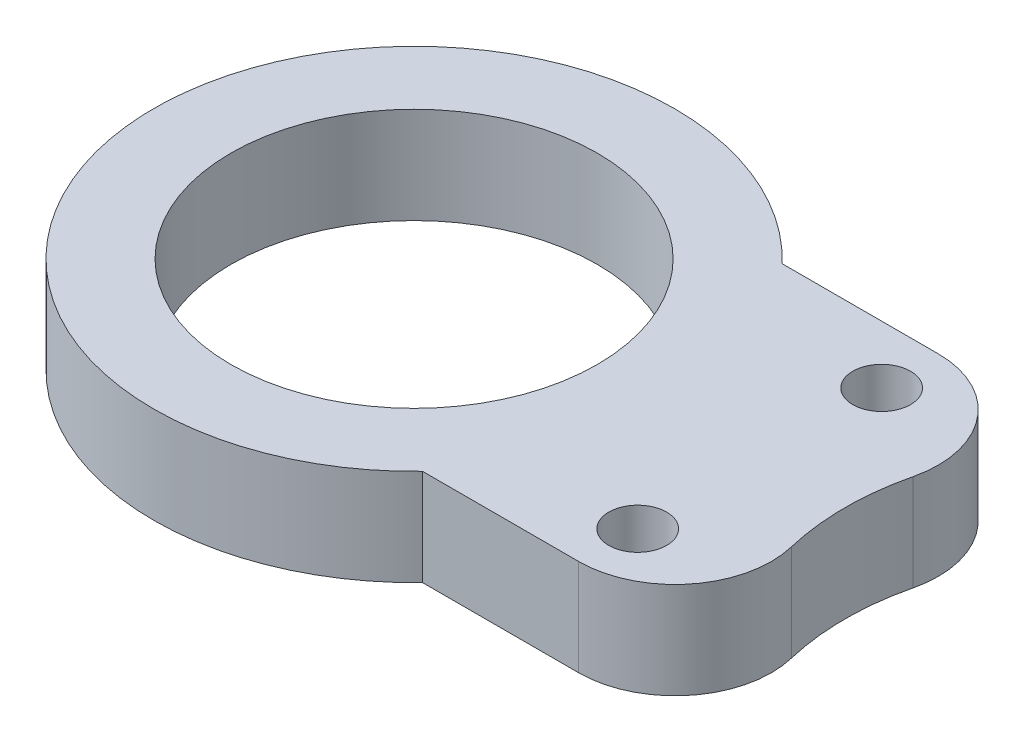
ISO-10303-21;
HEADER;
FILE_DESCRIPTION(('STEP AP214'),'2;1');
FILE_NAME('part.step','',(''),(''),'','','');
FILE_SCHEMA(('AUTOMOTIVE_DESIGN { 1 0 10303 214 1 1 1 1 }'));
ENDSEC;
DATA;
#1=APPLICATION_CONTEXT('core data for automotive mechanical design processes');
#2=APPLICATION_PROTOCOL_DEFINITION('international standard','automotive_design',2000,#1);
#3=PRODUCT_CONTEXT('',#1,'mechanical');
#4=PRODUCT('Part','Part','',(#3));
#5=PRODUCT_RELATED_PRODUCT_CATEGORY('part','',(#4));
#6=PRODUCT_DEFINITION_FORMATION('','',#4);
#7=PRODUCT_DEFINITION_CONTEXT('part definition',#1,'design');
#8=PRODUCT_DEFINITION('design','',#6,#7);
#9=PRODUCT_DEFINITION_SHAPE('','',#8);
#10=(LENGTH_UNIT() NAMED_UNIT(*) SI_UNIT(.MILLI.,.METRE.));
#11=(NAMED_UNIT(*) PLANE_ANGLE_UNIT() SI_UNIT($,.RADIAN.));
#12=(NAMED_UNIT(*) SI_UNIT($,.STERADIAN.) SOLID_ANGLE_UNIT());
#13=UNCERTAINTY_MEASURE_WITH_UNIT(LENGTH_MEASURE(1.E-05),#10,'distance_accuracy_value','');
#14=(GEOMETRIC_REPRESENTATION_CONTEXT(3) GLOBAL_UNCERTAINTY_ASSIGNED_CONTEXT((#13)) GLOBAL_UNIT_ASSIGNED_CONTEXT((#10,
#11,#12)) REPRESENTATION_CONTEXT('',''));
#15=CARTESIAN_POINT('',(0.,0.,0.));
#16=DIRECTION('',(0.,0.,1.));
#17=DIRECTION('',(1.,0.,0.));
#18=AXIS2_PLACEMENT_3D('',#15,#16,#17);
#19=CARTESIAN_POINT('',(-17.9245283018868,-2.35849056603774,0.));
#20=DIRECTION('',(0.,1.,0.));
#21=DIRECTION('',(0.,0.,-1.));
#22=AXIS2_PLACEMENT_3D('',#19,#20,#21);
#23=PLANE('',#22);
#24=CARTESIAN_POINT('',(0.,-2.35849056603774,6.32547169811321));
#25=DIRECTION('',(0.,-1.,0.));
#26=DIRECTION('',(0.,0.,-1.));
#27=AXIS2_PLACEMENT_3D('',#24,#25,#26);
#28=CIRCLE('',#27,1.5);
#29=CARTESIAN_POINT('',(0.,-2.35849056603774,4.82547169811321));
#30=VERTEX_POINT('',#29);
#31=EDGE_CURVE('E145',#30,#30,#28,.T.);
#32=ORIENTED_EDGE('',*,*,#31,.F.);
#33=EDGE_LOOP('',(#32));
#34=FACE_BOUND('',#33,.T.);
#35=CARTESIAN_POINT('',(0.,-2.35849056603774,-6.3254716981132));
#36=DIRECTION('',(0.,-1.,0.));
#37=DIRECTION('',(0.,0.,-1.));
#38=AXIS2_PLACEMENT_3D('',#35,#36,#37);
#39=CIRCLE('',#38,1.5);
#40=CARTESIAN_POINT('',(0.,-2.35849056603774,-7.8254716981132));
#41=VERTEX_POINT('',#40);
#42=EDGE_CURVE('E146',#41,#41,#39,.T.);
#43=ORIENTED_EDGE('',*,*,#42,.F.);
#44=EDGE_LOOP('',(#43));
#45=FACE_BOUND('',#44,.T.);
#46=CARTESIAN_POINT('',(-17.9245283018868,-2.35849056603774,0.));
#47=DIRECTION('',(0.,-1.,0.));
#48=DIRECTION('',(0.,0.,-1.));
#49=AXIS2_PLACEMENT_3D('',#46,#47,#48);
#50=CIRCLE('',#49,9.5);
#51=CARTESIAN_POINT('',(-17.9245283018868,-2.35849056603774,-9.5));
#52=VERTEX_POINT('',#51);
#53=EDGE_CURVE('E138',#52,#52,#50,.T.);
#54=ORIENTED_EDGE('',*,*,#53,.F.);
#55=EDGE_LOOP('',(#54));
#56=FACE_BOUND('',#55,.T.);
#57=CARTESIAN_POINT('',(17.9245283018868,-2.35849056603774,0.));
#58=DIRECTION('',(0.,-1.,0.));
#59=DIRECTION('',(0.,0.,-1.));
#60=AXIS2_PLACEMENT_3D('',#57,#58,#59);
#61=CIRCLE('',#60,13.5);
#62=CARTESIAN_POINT('',(4.79871482734986,-2.35849056603774,3.15642529321774));
#63=VERTEX_POINT('',#62);
#64=CARTESIAN_POINT('',(4.79871482734986,-2.35849056603774,-3.15642529321774));
#65=VERTEX_POINT('',#64);
#66=EDGE_CURVE('E143',#63,#65,#61,.T.);
#67=ORIENTED_EDGE('',*,*,#66,.F.);
#68=CARTESIAN_POINT('',(-0.0626975706267828,-2.35849056603774,4.32547169811322));
#69=DIRECTION('',(0.,-1.,0.));
#70=DIRECTION('',(0.,0.,-1.));
#71=AXIS2_PLACEMENT_3D('',#68,#69,#70);
#72=CIRCLE('',#71,5.);
#73=CARTESIAN_POINT('',(-0.0626975706267898,-2.35849056603774,9.32547169811321));
#74=VERTEX_POINT('',#73);
#75=EDGE_CURVE('E130',#74,#63,#72,.F.);
#76=ORIENTED_EDGE('',*,*,#75,.F.);
#77=DIRECTION('',(-1.,0.,0.));
#78=VECTOR('',#77,1.);
#79=CARTESIAN_POINT('',(8.16309512802911,-2.35849056603774,9.32547169811322));
#80=LINE('',#79,#78);
#81=CARTESIAN_POINT('',(-8.16309512802911,-2.35849056603774,9.32547169811322));
#82=VERTEX_POINT('',#81);
#83=EDGE_CURVE('E137',#74,#82,#80,.T.);
#84=ORIENTED_EDGE('',*,*,#83,.T.);
#85=CARTESIAN_POINT('',(-17.9245283018868,-2.35849056603774,0.));
#86=DIRECTION('',(0.,-1.,0.));
#87=DIRECTION('',(0.,0.,-1.));
#88=AXIS2_PLACEMENT_3D('',#85,#86,#87);
#89=CIRCLE('',#88,13.5);
#90=CARTESIAN_POINT('',(-8.1630951280291,-2.35849056603774,-9.3254716981132));
#91=VERTEX_POINT('',#90);
#92=EDGE_CURVE('E136',#82,#91,#89,.T.);
#93=ORIENTED_EDGE('',*,*,#92,.T.);
#94=DIRECTION('',(1.,0.,0.));
#95=VECTOR('',#94,1.);
#96=CARTESIAN_POINT('',(-8.1630951280291,-2.35849056603774,-9.3254716981132));
#97=LINE('',#96,#95);
#98=CARTESIAN_POINT('',(-0.0626975706267915,-2.35849056603774,-9.3254716981132));
#99=VERTEX_POINT('',#98);
#100=EDGE_CURVE('E117',#91,#99,#97,.T.);
#101=ORIENTED_EDGE('',*,*,#100,.T.);
#102=CARTESIAN_POINT('',(-0.0626975706267898,-2.35849056603774,-4.3254716981132));
#103=DIRECTION('',(0.,-1.,0.));
#104=DIRECTION('',(0.,0.,-1.));
#105=AXIS2_PLACEMENT_3D('',#102,#103,#104);
#106=CIRCLE('',#105,5.);
#107=EDGE_CURVE('E49',#65,#99,#106,.F.);
#108=ORIENTED_EDGE('',*,*,#107,.F.);
#109=EDGE_LOOP('',(#67,#76,#84,#93,#101,#108));
#110=FACE_BOUND('',#109,.T.);
#111=ADVANCED_FACE('F41',(#34,#45,#56,#110),#23,.F.);
#112=CARTESIAN_POINT('',(-8.1630951280291,-2.35849056603774,-9.3254716981132));
#113=DIRECTION('',(0.,0.,-1.));
#114=DIRECTION('',(1.,0.,0.));
#115=AXIS2_PLACEMENT_3D('',#112,#113,#114);
#116=PLANE('',#115);
#117=ORIENTED_EDGE('',*,*,#100,.F.);
#118=DIRECTION('',(0.,1.,0.));
#119=VECTOR('',#118,1.);
#120=CARTESIAN_POINT('',(-8.1630951280291,-2.35849056603774,-9.3254716981132));
#121=LINE('',#120,#119);
#122=CARTESIAN_POINT('',(-8.16309512802909,2.64150943396226,-9.32547169811321));
#123=VERTEX_POINT('',#122);
#124=EDGE_CURVE('E99',#91,#123,#121,.T.);
#125=ORIENTED_EDGE('',*,*,#124,.T.);
#126=DIRECTION('',(1.,0.,0.));
#127=VECTOR('',#126,1.);
#128=CARTESIAN_POINT('',(-8.16309512802909,2.64150943396226,-9.32547169811321));
#129=LINE('',#128,#127);
#130=CARTESIAN_POINT('',(-0.0626975706267911,2.64150943396226,-9.32547169811321));
#131=VERTEX_POINT('',#130);
#132=EDGE_CURVE('E104',#123,#131,#129,.T.);
#133=ORIENTED_EDGE('',*,*,#132,.T.);
#134=DIRECTION('',(0.,-1.,0.));
#135=VECTOR('',#134,1.);
#136=CARTESIAN_POINT('',(-0.0626975706267911,2.35849056603773,-9.32547169811321));
#137=LINE('',#136,#135);
#138=EDGE_CURVE('E119',#99,#131,#137,.F.);
#139=ORIENTED_EDGE('',*,*,#138,.F.);
#140=EDGE_LOOP('',(#117,#125,#133,#139));
#141=FACE_BOUND('',#140,.T.);
#142=ADVANCED_FACE('F115',(#141),#116,.T.);
#143=CARTESIAN_POINT('',(-17.9245283018868,-2.35849056603774,0.));
#144=DIRECTION('',(0.,1.,0.));
#145=DIRECTION('',(0.,0.,-1.));
#146=AXIS2_PLACEMENT_3D('',#143,#144,#145);
#147=CYLINDRICAL_SURFACE('',#146,13.5);
#148=ORIENTED_EDGE('',*,*,#124,.F.);
#149=ORIENTED_EDGE('',*,*,#92,.F.);
#150=DIRECTION('',(0.,1.,0.));
#151=VECTOR('',#150,1.);
#152=CARTESIAN_POINT('',(-8.16309512802911,-2.35849056603774,9.32547169811322));
#153=LINE('',#152,#151);
#154=CARTESIAN_POINT('',(-8.16309512802911,2.64150943396226,9.32547169811322));
#155=VERTEX_POINT('',#154);
#156=EDGE_CURVE('E101',#82,#155,#153,.T.);
#157=ORIENTED_EDGE('',*,*,#156,.T.);
#158=CARTESIAN_POINT('',(-17.9245283018868,2.64150943396226,0.));
#159=DIRECTION('',(0.,-1.,0.));
#160=DIRECTION('',(0.,0.,-1.));
#161=AXIS2_PLACEMENT_3D('',#158,#159,#160);
#162=CIRCLE('',#161,13.5);
#163=EDGE_CURVE('E94',#155,#123,#162,.T.);
#164=ORIENTED_EDGE('',*,*,#163,.T.);
#165=EDGE_LOOP('',(#148,#149,#157,#164));
#166=FACE_BOUND('',#165,.T.);
#167=ADVANCED_FACE('F96',(#166),#147,.T.);
#168=CARTESIAN_POINT('',(8.16309512802911,-2.35849056603774,9.32547169811322));
#169=DIRECTION('',(0.,0.,1.));
#170=DIRECTION('',(-1.,0.,0.));
#171=AXIS2_PLACEMENT_3D('',#168,#169,#170);
#172=PLANE('',#171);
#173=ORIENTED_EDGE('',*,*,#156,.F.);
#174=ORIENTED_EDGE('',*,*,#83,.F.);
#175=DIRECTION('',(0.,-1.,0.));
#176=VECTOR('',#175,1.);
#177=CARTESIAN_POINT('',(-0.0626975706267898,-2.35849056603774,9.32547169811321));
#178=LINE('',#177,#176);
#179=CARTESIAN_POINT('',(-0.0626975706267893,2.64150943396226,9.32547169811322));
#180=VERTEX_POINT('',#179);
#181=EDGE_CURVE('E11',#180,#74,#178,.T.);
#182=ORIENTED_EDGE('',*,*,#181,.F.);
#183=DIRECTION('',(-1.,0.,0.));
#184=VECTOR('',#183,1.);
#185=CARTESIAN_POINT('',(-0.0626975706267893,2.64150943396226,9.32547169811322));
#186=LINE('',#185,#184);
#187=EDGE_CURVE('E149',#180,#155,#186,.T.);
#188=ORIENTED_EDGE('',*,*,#187,.T.);
#189=EDGE_LOOP('',(#173,#174,#182,#188));
#190=FACE_BOUND('',#189,.T.);
#191=ADVANCED_FACE('F192',(#190),#172,.T.);
#192=CARTESIAN_POINT('',(-17.9245283018868,-2.35849056603774,0.));
#193=DIRECTION('',(0.,1.,0.));
#194=DIRECTION('',(0.,0.,-1.));
#195=AXIS2_PLACEMENT_3D('',#192,#193,#194);
#196=CYLINDRICAL_SURFACE('',#195,9.5);
#197=CARTESIAN_POINT('',(-17.9245283018868,2.64150943396226,0.));
#198=DIRECTION('',(0.,-1.,0.));
#199=DIRECTION('',(0.,0.,-1.));
#200=AXIS2_PLACEMENT_3D('',#197,#198,#199);
#201=CIRCLE('',#200,9.5);
#202=CARTESIAN_POINT('',(-17.9245283018868,2.64150943396226,-9.5));
#203=VERTEX_POINT('',#202);
#204=EDGE_CURVE('E105',#203,#203,#201,.T.);
#205=CARTESIAN_POINT('',(-17.9245283018868,-2.35849056603774,-9.5));
#206=CARTESIAN_POINT('',(-17.9245283018868,-2.30640723270441,-9.5));
#207=CARTESIAN_POINT('',(-17.9245283018868,-2.25432389937107,-9.5));
#208=CARTESIAN_POINT('',(-17.9245283018868,-2.15015723270441,-9.5));
#209=CARTESIAN_POINT('',(-17.9245283018868,-2.09807389937107,-9.5));
#210=CARTESIAN_POINT('',(-17.9245283018868,-1.99390723270441,-9.5));
#211=CARTESIAN_POINT('',(-17.9245283018868,-1.94182389937107,-9.5));
#212=CARTESIAN_POINT('',(-17.9245283018868,-1.8376572327044,-9.5));
#213=CARTESIAN_POINT('',(-17.9245283018868,-1.78557389937107,-9.5));
#214=CARTESIAN_POINT('',(-17.9245283018868,-1.6814072327044,-9.5));
#215=CARTESIAN_POINT('',(-17.9245283018868,-1.62932389937107,-9.5));
#216=CARTESIAN_POINT('',(-17.9245283018868,-1.5251572327044,-9.5));
#217=CARTESIAN_POINT('',(-17.9245283018868,-1.47307389937107,-9.5));
#218=CARTESIAN_POINT('',(-17.9245283018868,-1.3689072327044,-9.5));
#219=CARTESIAN_POINT('',(-17.9245283018868,-1.31682389937107,-9.5));
#220=CARTESIAN_POINT('',(-17.9245283018868,-1.2126572327044,-9.5));
#221=CARTESIAN_POINT('',(-17.9245283018868,-1.16057389937107,-9.5));
#222=CARTESIAN_POINT('',(-17.9245283018868,-1.0564072327044,-9.5));
#223=CARTESIAN_POINT('',(-17.9245283018868,-1.00432389937107,-9.5));
#224=CARTESIAN_POINT('',(-17.9245283018868,-0.900157232704405,-9.5));
#225=CARTESIAN_POINT('',(-17.9245283018868,-0.848073899371071,-9.5));
#226=CARTESIAN_POINT('',(-17.9245283018868,-0.743907232704405,-9.5));
#227=CARTESIAN_POINT('',(-17.9245283018868,-0.691823899371071,-9.5));
#228=CARTESIAN_POINT('',(-17.9245283018868,-0.587657232704405,-9.5));
#229=CARTESIAN_POINT('',(-17.9245283018868,-0.535573899371071,-9.5));
#230=CARTESIAN_POINT('',(-17.9245283018868,-0.431407232704405,-9.5));
#231=CARTESIAN_POINT('',(-17.9245283018868,-0.379323899371071,-9.5));
#232=CARTESIAN_POINT('',(-17.9245283018868,-0.275157232704404,-9.5));
#233=CARTESIAN_POINT('',(-17.9245283018868,-0.223073899371071,-9.5));
#234=CARTESIAN_POINT('',(-17.9245283018868,-0.118907232704404,-9.5));
#235=CARTESIAN_POINT('',(-17.9245283018868,-0.066823899371071,-9.5));
#236=CARTESIAN_POINT('',(-17.9245283018868,0.0373427672955957,-9.5));
#237=CARTESIAN_POINT('',(-17.9245283018868,0.0894261006289289,-9.5));
#238=CARTESIAN_POINT('',(-17.9245283018868,0.193592767295595,-9.5));
#239=CARTESIAN_POINT('',(-17.9245283018868,0.245676100628929,-9.5));
#240=CARTESIAN_POINT('',(-17.9245283018868,0.349842767295596,-9.5));
#241=CARTESIAN_POINT('',(-17.9245283018868,0.401926100628929,-9.5));
#242=CARTESIAN_POINT('',(-17.9245283018868,0.506092767295596,-9.5));
#243=CARTESIAN_POINT('',(-17.9245283018868,0.558176100628929,-9.5));
#244=CARTESIAN_POINT('',(-17.9245283018868,0.662342767295596,-9.5));
#245=CARTESIAN_POINT('',(-17.9245283018868,0.714426100628929,-9.5));
#246=CARTESIAN_POINT('',(-17.9245283018868,0.818592767295596,-9.5));
#247=CARTESIAN_POINT('',(-17.9245283018868,0.87067610062893,-9.5));
#248=CARTESIAN_POINT('',(-17.9245283018868,0.974842767295596,-9.5));
#249=CARTESIAN_POINT('',(-17.9245283018868,1.02692610062893,-9.5));
#250=CARTESIAN_POINT('',(-17.9245283018868,1.1310927672956,-9.5));
#251=CARTESIAN_POINT('',(-17.9245283018868,1.18317610062893,-9.5));
#252=CARTESIAN_POINT('',(-17.9245283018868,1.2873427672956,-9.5));
#253=CARTESIAN_POINT('',(-17.9245283018868,1.33942610062893,-9.5));
#254=CARTESIAN_POINT('',(-17.9245283018868,1.4435927672956,-9.5));
#255=CARTESIAN_POINT('',(-17.9245283018868,1.49567610062893,-9.5));
#256=CARTESIAN_POINT('',(-17.9245283018868,1.5998427672956,-9.5));
#257=CARTESIAN_POINT('',(-17.9245283018868,1.65192610062893,-9.5));
#258=CARTESIAN_POINT('',(-17.9245283018868,1.7560927672956,-9.5));
#259=CARTESIAN_POINT('',(-17.9245283018868,1.80817610062893,-9.5));
#260=CARTESIAN_POINT('',(-17.9245283018868,1.9123427672956,-9.5));
#261=CARTESIAN_POINT('',(-17.9245283018868,1.96442610062893,-9.5));
#262=CARTESIAN_POINT('',(-17.9245283018868,2.0685927672956,-9.5));
#263=CARTESIAN_POINT('',(-17.9245283018868,2.12067610062893,-9.5));
#264=CARTESIAN_POINT('',(-17.9245283018868,2.2248427672956,-9.5));
#265=CARTESIAN_POINT('',(-17.9245283018868,2.27692610062893,-9.5));
#266=CARTESIAN_POINT('',(-17.9245283018868,2.3810927672956,-9.5));
#267=CARTESIAN_POINT('',(-17.9245283018868,2.43317610062893,-9.5));
#268=CARTESIAN_POINT('',(-17.9245283018868,2.5373427672956,-9.5));
#269=CARTESIAN_POINT('',(-17.9245283018868,2.58942610062893,-9.5));
#270=CARTESIAN_POINT('',(-17.9245283018868,2.64150943396226,-9.5));
#271=B_SPLINE_CURVE_WITH_KNOTS('',3,(#205,#206,#207,#208,#209,#210,#211,#212,#213,#214,#215,
#216,#217,#218,#219,#220,#221,#222,#223,#224,#225,#226,#227,#228,#229,#230,#231,#232,#233,#234,
#235,#236,#237,#238,#239,#240,#241,#242,#243,#244,#245,#246,#247,#248,#249,#250,#251,#252,#253,
#254,#255,#256,#257,#258,#259,#260,#261,#262,#263,#264,#265,#266,#267,#268,#269,#270),
.UNSPECIFIED.,.F.,.F.,(4,2,2,2,2,2,2,2,2,2,2,2,2,2,2,2,2,2,2,2,2,2,2,2,2,2,2,2,2,2,2,2,4),(0.,
0.15625,0.3125,0.46875,0.625000000000001,0.781250000000001,0.937500000000001,1.09375,1.25,
1.40625,1.5625,1.71875,1.875,2.03125,2.1875,2.34375,2.5,2.65625,2.8125,2.96875,3.125,3.28125,
3.4375,3.59375,3.75,3.90625,4.0625,4.21875,4.375,4.53125,4.6875,4.84375,5.),.UNSPECIFIED.);
#272=EDGE_CURVE('BSEAM195',#52,#203,#271,.T.);
#273=ORIENTED_EDGE('',*,*,#53,.T.);
#274=ORIENTED_EDGE('',*,*,#204,.F.);
#275=ORIENTED_EDGE('',*,*,#272,.T.);
#276=ORIENTED_EDGE('',*,*,#272,.F.);
#277=EDGE_LOOP('',(#273,#275,#274,#276));
#278=FACE_BOUND('',#277,.T.);
#279=ADVANCED_FACE('F195',(#278),#196,.F.);
#280=CARTESIAN_POINT('',(17.9245283018868,-2.35849056603774,0.));
#281=DIRECTION('',(0.,1.,0.));
#282=DIRECTION('',(0.,0.,-1.));
#283=AXIS2_PLACEMENT_3D('',#280,#281,#282);
#284=CYLINDRICAL_SURFACE('',#283,13.5);
#285=DIRECTION('',(0.,1.,0.));
#286=VECTOR('',#285,1.);
#287=CARTESIAN_POINT('',(4.79871482734985,-2.35849056603774,3.15642529321775));
#288=LINE('',#287,#286);
#289=CARTESIAN_POINT('',(4.79871482734986,2.64150943396226,3.15642529321775));
#290=VERTEX_POINT('',#289);
#291=EDGE_CURVE('E121',#63,#290,#288,.T.);
#292=ORIENTED_EDGE('',*,*,#291,.F.);
#293=ORIENTED_EDGE('',*,*,#66,.T.);
#294=DIRECTION('',(0.,1.,0.));
#295=VECTOR('',#294,1.);
#296=CARTESIAN_POINT('',(4.79871482734985,-2.35849056603774,-3.15642529321774));
#297=LINE('',#296,#295);
#298=CARTESIAN_POINT('',(4.79871482734987,2.64150943396227,-3.15642529321775));
#299=VERTEX_POINT('',#298);
#300=EDGE_CURVE('E62',#299,#65,#297,.F.);
#301=ORIENTED_EDGE('',*,*,#300,.F.);
#302=CARTESIAN_POINT('',(17.9245283018868,2.64150943396226,0.));
#303=DIRECTION('',(0.,1.,0.));
#304=DIRECTION('',(0.,0.,-1.));
#305=AXIS2_PLACEMENT_3D('',#302,#303,#304);
#306=CIRCLE('',#305,13.5);
#307=EDGE_CURVE('E155',#299,#290,#306,.T.);
#308=ORIENTED_EDGE('',*,*,#307,.T.);
#309=EDGE_LOOP('',(#292,#293,#301,#308));
#310=FACE_BOUND('',#309,.T.);
#311=ADVANCED_FACE('F178',(#310),#284,.F.);
#312=CARTESIAN_POINT('',(0.,-2.35849056603774,-6.3254716981132));
#313=DIRECTION('',(0.,1.,0.));
#314=DIRECTION('',(0.,0.,-1.));
#315=AXIS2_PLACEMENT_3D('',#312,#313,#314);
#316=CYLINDRICAL_SURFACE('',#315,1.5);
#317=CARTESIAN_POINT('',(0.,2.64150943396227,-6.3254716981132));
#318=DIRECTION('',(0.,-1.,0.));
#319=DIRECTION('',(0.,0.,-1.));
#320=AXIS2_PLACEMENT_3D('',#317,#318,#319);
#321=CIRCLE('',#320,1.5);
#322=CARTESIAN_POINT('',(0.,2.64150943396227,-7.8254716981132));
#323=VERTEX_POINT('',#322);
#324=EDGE_CURVE('E161',#323,#323,#321,.T.);
#325=CARTESIAN_POINT('',(0.,-2.35849056603774,-7.8254716981132));
#326=CARTESIAN_POINT('',(0.,-2.3064072327044,-7.8254716981132));
#327=CARTESIAN_POINT('',(0.,-2.25432389937107,-7.8254716981132));
#328=CARTESIAN_POINT('',(0.,-2.1501572327044,-7.8254716981132));
#329=CARTESIAN_POINT('',(0.,-2.09807389937107,-7.8254716981132));
#330=CARTESIAN_POINT('',(0.,-1.9939072327044,-7.8254716981132));
#331=CARTESIAN_POINT('',(0.,-1.94182389937107,-7.8254716981132));
#332=CARTESIAN_POINT('',(0.,-1.8376572327044,-7.8254716981132));
#333=CARTESIAN_POINT('',(0.,-1.78557389937107,-7.8254716981132));
#334=CARTESIAN_POINT('',(0.,-1.6814072327044,-7.8254716981132));
#335=CARTESIAN_POINT('',(0.,-1.62932389937107,-7.8254716981132));
#336=CARTESIAN_POINT('',(0.,-1.5251572327044,-7.8254716981132));
#337=CARTESIAN_POINT('',(0.,-1.47307389937107,-7.8254716981132));
#338=CARTESIAN_POINT('',(0.,-1.3689072327044,-7.8254716981132));
#339=CARTESIAN_POINT('',(0.,-1.31682389937107,-7.8254716981132));
#340=CARTESIAN_POINT('',(0.,-1.2126572327044,-7.8254716981132));
#341=CARTESIAN_POINT('',(0.,-1.16057389937107,-7.8254716981132));
#342=CARTESIAN_POINT('',(0.,-1.0564072327044,-7.8254716981132));
#343=CARTESIAN_POINT('',(0.,-1.00432389937107,-7.8254716981132));
#344=CARTESIAN_POINT('',(0.,-0.900157232704401,-7.8254716981132));
#345=CARTESIAN_POINT('',(0.,-0.848073899371068,-7.8254716981132));
#346=CARTESIAN_POINT('',(0.,-0.743907232704401,-7.8254716981132));
#347=CARTESIAN_POINT('',(0.,-0.691823899371068,-7.8254716981132));
#348=CARTESIAN_POINT('',(0.,-0.587657232704401,-7.8254716981132));
#349=CARTESIAN_POINT('',(0.,-0.535573899371068,-7.8254716981132));
#350=CARTESIAN_POINT('',(0.,-0.431407232704401,-7.8254716981132));
#351=CARTESIAN_POINT('',(0.,-0.379323899371067,-7.8254716981132));
#352=CARTESIAN_POINT('',(0.,-0.275157232704401,-7.8254716981132));
#353=CARTESIAN_POINT('',(0.,-0.223073899371067,-7.8254716981132));
#354=CARTESIAN_POINT('',(0.,-0.1189072327044,-7.8254716981132));
#355=CARTESIAN_POINT('',(0.,-0.066823899371067,-7.8254716981132));
#356=CARTESIAN_POINT('',(0.,0.0373427672955995,-7.8254716981132));
#357=CARTESIAN_POINT('',(0.,0.0894261006289328,-7.8254716981132));
#358=CARTESIAN_POINT('',(0.,0.193592767295599,-7.8254716981132));
#359=CARTESIAN_POINT('',(0.,0.245676100628933,-7.8254716981132));
#360=CARTESIAN_POINT('',(0.,0.3498427672956,-7.8254716981132));
#361=CARTESIAN_POINT('',(0.,0.401926100628933,-7.8254716981132));
#362=CARTESIAN_POINT('',(0.,0.5060927672956,-7.8254716981132));
#363=CARTESIAN_POINT('',(0.,0.558176100628933,-7.8254716981132));
#364=CARTESIAN_POINT('',(0.,0.6623427672956,-7.8254716981132));
#365=CARTESIAN_POINT('',(0.,0.714426100628933,-7.8254716981132));
#366=CARTESIAN_POINT('',(0.,0.8185927672956,-7.8254716981132));
#367=CARTESIAN_POINT('',(0.,0.870676100628933,-7.8254716981132));
#368=CARTESIAN_POINT('',(0.,0.9748427672956,-7.8254716981132));
#369=CARTESIAN_POINT('',(0.,1.02692610062893,-7.8254716981132));
#370=CARTESIAN_POINT('',(0.,1.1310927672956,-7.8254716981132));
#371=CARTESIAN_POINT('',(0.,1.18317610062893,-7.8254716981132));
#372=CARTESIAN_POINT('',(0.,1.2873427672956,-7.8254716981132));
#373=CARTESIAN_POINT('',(0.,1.33942610062893,-7.8254716981132));
#374=CARTESIAN_POINT('',(0.,1.4435927672956,-7.8254716981132));
#375=CARTESIAN_POINT('',(0.,1.49567610062893,-7.8254716981132));
#376=CARTESIAN_POINT('',(0.,1.5998427672956,-7.8254716981132));
#377=CARTESIAN_POINT('',(0.,1.65192610062893,-7.8254716981132));
#378=CARTESIAN_POINT('',(0.,1.7560927672956,-7.8254716981132));
#379=CARTESIAN_POINT('',(0.,1.80817610062893,-7.8254716981132));
#380=CARTESIAN_POINT('',(0.,1.9123427672956,-7.8254716981132));
#381=CARTESIAN_POINT('',(0.,1.96442610062893,-7.8254716981132));
#382=CARTESIAN_POINT('',(0.,2.0685927672956,-7.8254716981132));
#383=CARTESIAN_POINT('',(0.,2.12067610062893,-7.8254716981132));
#384=CARTESIAN_POINT('',(0.,2.2248427672956,-7.8254716981132));
#385=CARTESIAN_POINT('',(0.,2.27692610062893,-7.8254716981132));
#386=CARTESIAN_POINT('',(0.,2.3810927672956,-7.8254716981132));
#387=CARTESIAN_POINT('',(0.,2.43317610062893,-7.8254716981132));
#388=CARTESIAN_POINT('',(0.,2.5373427672956,-7.8254716981132));
#389=CARTESIAN_POINT('',(0.,2.58942610062893,-7.8254716981132));
#390=CARTESIAN_POINT('',(0.,2.64150943396227,-7.8254716981132));
#391=B_SPLINE_CURVE_WITH_KNOTS('',3,(#325,#326,#327,#328,#329,#330,#331,#332,#333,#334,#335,
#336,#337,#338,#339,#340,#341,#342,#343,#344,#345,#346,#347,#348,#349,#350,#351,#352,#353,#354,
#355,#356,#357,#358,#359,#360,#361,#362,#363,#364,#365,#366,#367,#368,#369,#370,#371,#372,#373,
#374,#375,#376,#377,#378,#379,#380,#381,#382,#383,#384,#385,#386,#387,#388,#389,#390),
.UNSPECIFIED.,.F.,.F.,(4,2,2,2,2,2,2,2,2,2,2,2,2,2,2,2,2,2,2,2,2,2,2,2,2,2,2,2,2,2,2,2,4),(0.,
0.15625,0.3125,0.46875,0.625,0.78125,0.9375,1.09375,1.25,1.40625,1.5625,1.71875,1.875,2.03125,
2.1875,2.34375,2.5,2.65625,2.8125,2.96875,3.125,3.28125,3.4375,3.59375,3.75,3.90625,4.0625,
4.21875,4.375,4.53125,4.6875,4.84375,5.),.UNSPECIFIED.);
#392=EDGE_CURVE('BSEAM171',#41,#323,#391,.T.);
#393=ORIENTED_EDGE('',*,*,#42,.T.);
#394=ORIENTED_EDGE('',*,*,#324,.F.);
#395=ORIENTED_EDGE('',*,*,#392,.T.);
#396=ORIENTED_EDGE('',*,*,#392,.F.);
#397=EDGE_LOOP('',(#393,#395,#394,#396));
#398=FACE_BOUND('',#397,.T.);
#399=ADVANCED_FACE('F171',(#398),#316,.F.);
#400=CARTESIAN_POINT('',(0.,-2.35849056603774,6.32547169811321));
#401=DIRECTION('',(0.,1.,0.));
#402=DIRECTION('',(0.,0.,-1.));
#403=AXIS2_PLACEMENT_3D('',#400,#401,#402);
#404=CYLINDRICAL_SURFACE('',#403,1.5);
#405=CARTESIAN_POINT('',(0.,2.64150943396226,6.32547169811322));
#406=DIRECTION('',(0.,-1.,0.));
#407=DIRECTION('',(0.,0.,-1.));
#408=AXIS2_PLACEMENT_3D('',#405,#406,#407);
#409=CIRCLE('',#408,1.5);
#410=CARTESIAN_POINT('',(0.,2.64150943396226,4.82547169811321));
#411=VERTEX_POINT('',#410);
#412=EDGE_CURVE('E164',#411,#411,#409,.T.);
#413=CARTESIAN_POINT('',(0.,-2.35849056603774,4.82547169811321));
#414=CARTESIAN_POINT('',(0.,-2.3064072327044,4.82547169811321));
#415=CARTESIAN_POINT('',(0.,-2.25432389937107,4.82547169811321));
#416=CARTESIAN_POINT('',(0.,-2.1501572327044,4.82547169811321));
#417=CARTESIAN_POINT('',(0.,-2.09807389937107,4.82547169811321));
#418=CARTESIAN_POINT('',(0.,-1.9939072327044,4.82547169811321));
#419=CARTESIAN_POINT('',(0.,-1.94182389937107,4.82547169811321));
#420=CARTESIAN_POINT('',(0.,-1.8376572327044,4.82547169811321));
#421=CARTESIAN_POINT('',(0.,-1.78557389937107,4.82547169811321));
#422=CARTESIAN_POINT('',(0.,-1.6814072327044,4.82547169811321));
#423=CARTESIAN_POINT('',(0.,-1.62932389937107,4.82547169811321));
#424=CARTESIAN_POINT('',(0.,-1.5251572327044,4.82547169811321));
#425=CARTESIAN_POINT('',(0.,-1.47307389937107,4.82547169811321));
#426=CARTESIAN_POINT('',(0.,-1.3689072327044,4.82547169811321));
#427=CARTESIAN_POINT('',(0.,-1.31682389937107,4.82547169811321));
#428=CARTESIAN_POINT('',(0.,-1.2126572327044,4.82547169811321));
#429=CARTESIAN_POINT('',(0.,-1.16057389937107,4.82547169811321));
#430=CARTESIAN_POINT('',(0.,-1.0564072327044,4.82547169811321));
#431=CARTESIAN_POINT('',(0.,-1.00432389937107,4.82547169811321));
#432=CARTESIAN_POINT('',(0.,-0.900157232704402,4.82547169811321));
#433=CARTESIAN_POINT('',(0.,-0.848073899371069,4.82547169811321));
#434=CARTESIAN_POINT('',(0.,-0.743907232704402,4.82547169811321));
#435=CARTESIAN_POINT('',(0.,-0.691823899371069,4.82547169811321));
#436=CARTESIAN_POINT('',(0.,-0.587657232704402,4.82547169811321));
#437=CARTESIAN_POINT('',(0.,-0.535573899371069,4.82547169811321));
#438=CARTESIAN_POINT('',(0.,-0.431407232704402,4.82547169811321));
#439=CARTESIAN_POINT('',(0.,-0.379323899371069,4.82547169811321));
#440=CARTESIAN_POINT('',(0.,-0.275157232704402,4.82547169811321));
#441=CARTESIAN_POINT('',(0.,-0.223073899371069,4.82547169811321));
#442=CARTESIAN_POINT('',(0.,-0.118907232704402,4.82547169811321));
#443=CARTESIAN_POINT('',(0.,-0.0668238993710688,4.82547169811321));
#444=CARTESIAN_POINT('',(0.,0.0373427672955978,4.82547169811321));
#445=CARTESIAN_POINT('',(0.,0.0894261006289311,4.82547169811321));
#446=CARTESIAN_POINT('',(0.,0.193592767295598,4.82547169811321));
#447=CARTESIAN_POINT('',(0.,0.245676100628931,4.82547169811321));
#448=CARTESIAN_POINT('',(0.,0.349842767295598,4.82547169811321));
#449=CARTESIAN_POINT('',(0.,0.401926100628931,4.82547169811321));
#450=CARTESIAN_POINT('',(0.,0.506092767295598,4.82547169811321));
#451=CARTESIAN_POINT('',(0.,0.558176100628931,4.82547169811321));
#452=CARTESIAN_POINT('',(0.,0.662342767295598,4.82547169811321));
#453=CARTESIAN_POINT('',(0.,0.714426100628931,4.82547169811321));
#454=CARTESIAN_POINT('',(0.,0.818592767295598,4.82547169811321));
#455=CARTESIAN_POINT('',(0.,0.870676100628931,4.82547169811321));
#456=CARTESIAN_POINT('',(0.,0.974842767295598,4.82547169811321));
#457=CARTESIAN_POINT('',(0.,1.02692610062893,4.82547169811321));
#458=CARTESIAN_POINT('',(0.,1.1310927672956,4.82547169811321));
#459=CARTESIAN_POINT('',(0.,1.18317610062893,4.82547169811321));
#460=CARTESIAN_POINT('',(0.,1.2873427672956,4.82547169811321));
#461=CARTESIAN_POINT('',(0.,1.33942610062893,4.82547169811321));
#462=CARTESIAN_POINT('',(0.,1.4435927672956,4.82547169811321));
#463=CARTESIAN_POINT('',(0.,1.49567610062893,4.82547169811321));
#464=CARTESIAN_POINT('',(0.,1.5998427672956,4.82547169811321));
#465=CARTESIAN_POINT('',(0.,1.65192610062893,4.82547169811321));
#466=CARTESIAN_POINT('',(0.,1.7560927672956,4.82547169811321));
#467=CARTESIAN_POINT('',(0.,1.80817610062893,4.82547169811321));
#468=CARTESIAN_POINT('',(0.,1.9123427672956,4.82547169811321));
#469=CARTESIAN_POINT('',(0.,1.96442610062893,4.82547169811321));
#470=CARTESIAN_POINT('',(0.,2.0685927672956,4.82547169811321));
#471=CARTESIAN_POINT('',(0.,2.12067610062893,4.82547169811321));
#472=CARTESIAN_POINT('',(0.,2.2248427672956,4.82547169811321));
#473=CARTESIAN_POINT('',(0.,2.27692610062893,4.82547169811321));
#474=CARTESIAN_POINT('',(0.,2.3810927672956,4.82547169811321));
#475=CARTESIAN_POINT('',(0.,2.43317610062893,4.82547169811321));
#476=CARTESIAN_POINT('',(0.,2.5373427672956,4.82547169811321));
#477=CARTESIAN_POINT('',(0.,2.58942610062893,4.82547169811321));
#478=CARTESIAN_POINT('',(0.,2.64150943396226,4.82547169811321));
#479=B_SPLINE_CURVE_WITH_KNOTS('',3,(#413,#414,#415,#416,#417,#418,#419,#420,#421,#422,#423,
#424,#425,#426,#427,#428,#429,#430,#431,#432,#433,#434,#435,#436,#437,#438,#439,#440,#441,#442,
#443,#444,#445,#446,#447,#448,#449,#450,#451,#452,#453,#454,#455,#456,#457,#458,#459,#460,#461,
#462,#463,#464,#465,#466,#467,#468,#469,#470,#471,#472,#473,#474,#475,#476,#477,#478),
.UNSPECIFIED.,.F.,.F.,(4,2,2,2,2,2,2,2,2,2,2,2,2,2,2,2,2,2,2,2,2,2,2,2,2,2,2,2,2,2,2,2,4),(0.,
0.15625,0.3125,0.46875,0.625,0.78125,0.9375,1.09375,1.25,1.40625,1.5625,1.71875,1.875,2.03125,
2.1875,2.34375,2.5,2.65625,2.8125,2.96875,3.125,3.28125,3.4375,3.59375,3.75,3.90625,4.0625,
4.21875,4.375,4.53125,4.6875,4.84375,5.),.UNSPECIFIED.);
#480=EDGE_CURVE('BSEAM169',#30,#411,#479,.T.);
#481=ORIENTED_EDGE('',*,*,#31,.T.);
#482=ORIENTED_EDGE('',*,*,#412,.F.);
#483=ORIENTED_EDGE('',*,*,#480,.T.);
#484=ORIENTED_EDGE('',*,*,#480,.F.);
#485=EDGE_LOOP('',(#481,#483,#482,#484));
#486=FACE_BOUND('',#485,.T.);
#487=ADVANCED_FACE('F169',(#486),#404,.F.);
#488=CARTESIAN_POINT('',(-0.0626975706267898,-2.35849056603774,-4.3254716981132));
#489=DIRECTION('',(0.,1.,0.));
#490=DIRECTION('',(0.,0.,-1.));
#491=AXIS2_PLACEMENT_3D('',#488,#489,#490);
#492=CYLINDRICAL_SURFACE('',#491,5.);
#493=ORIENTED_EDGE('',*,*,#107,.T.);
#494=ORIENTED_EDGE('',*,*,#138,.T.);
#495=CARTESIAN_POINT('',(-0.062697570626798,2.64150943396227,-4.32547169811321));
#496=DIRECTION('',(0.,-1.,0.));
#497=DIRECTION('',(0.,0.,-1.));
#498=AXIS2_PLACEMENT_3D('',#495,#496,#497);
#499=CIRCLE('',#498,5.);
#500=EDGE_CURVE('E111',#131,#299,#499,.T.);
#501=ORIENTED_EDGE('',*,*,#500,.T.);
#502=ORIENTED_EDGE('',*,*,#300,.T.);
#503=EDGE_LOOP('',(#493,#494,#501,#502));
#504=FACE_BOUND('',#503,.T.);
#505=ADVANCED_FACE('F131',(#504),#492,.T.);
#506=CARTESIAN_POINT('',(-0.0626975706267828,-2.35849056603774,4.32547169811322));
#507=DIRECTION('',(0.,1.,0.));
#508=DIRECTION('',(0.,0.,-1.));
#509=AXIS2_PLACEMENT_3D('',#506,#507,#508);
#510=CYLINDRICAL_SURFACE('',#509,5.);
#511=ORIENTED_EDGE('',*,*,#75,.T.);
#512=ORIENTED_EDGE('',*,*,#291,.T.);
#513=CARTESIAN_POINT('',(-0.0626975706267824,2.64150943396226,4.32547169811322));
#514=DIRECTION('',(0.,-1.,0.));
#515=DIRECTION('',(0.,0.,-1.));
#516=AXIS2_PLACEMENT_3D('',#513,#514,#515);
#517=CIRCLE('',#516,5.);
#518=EDGE_CURVE('E153',#290,#180,#517,.T.);
#519=ORIENTED_EDGE('',*,*,#518,.T.);
#520=ORIENTED_EDGE('',*,*,#181,.T.);
#521=EDGE_LOOP('',(#511,#512,#519,#520));
#522=FACE_BOUND('',#521,.T.);
#523=ADVANCED_FACE('F43',(#522),#510,.T.);
#524=CARTESIAN_POINT('',(-17.9245283018868,2.64150943396226,0.));
#525=DIRECTION('',(0.,1.,0.));
#526=DIRECTION('',(0.,0.,-1.));
#527=AXIS2_PLACEMENT_3D('',#524,#525,#526);
#528=PLANE('',#527);
#529=ORIENTED_EDGE('',*,*,#324,.T.);
#530=EDGE_LOOP('',(#529));
#531=FACE_BOUND('',#530,.T.);
#532=ORIENTED_EDGE('',*,*,#163,.F.);
#533=ORIENTED_EDGE('',*,*,#187,.F.);
#534=ORIENTED_EDGE('',*,*,#518,.F.);
#535=ORIENTED_EDGE('',*,*,#307,.F.);
#536=ORIENTED_EDGE('',*,*,#500,.F.);
#537=ORIENTED_EDGE('',*,*,#132,.F.);
#538=EDGE_LOOP('',(#532,#533,#534,#535,#536,#537));
#539=FACE_BOUND('',#538,.T.);
#540=ORIENTED_EDGE('',*,*,#204,.T.);
#541=EDGE_LOOP('',(#540));
#542=FACE_BOUND('',#541,.T.);
#543=ORIENTED_EDGE('',*,*,#412,.T.);
#544=EDGE_LOOP('',(#543));
#545=FACE_BOUND('',#544,.T.);
#546=ADVANCED_FACE('F108',(#531,#539,#542,#545),#528,.T.);
#547=CLOSED_SHELL('',(#111,#142,#167,#191,#279,#311,#399,#487,#505,#523,#546));
#548=MANIFOLD_SOLID_BREP('B2',#547);
#549=ADVANCED_BREP_SHAPE_REPRESENTATION('',(#18,#548),#14);
#550=SHAPE_DEFINITION_REPRESENTATION(#9,#549);
ENDSEC;
END-ISO-10303-21;
